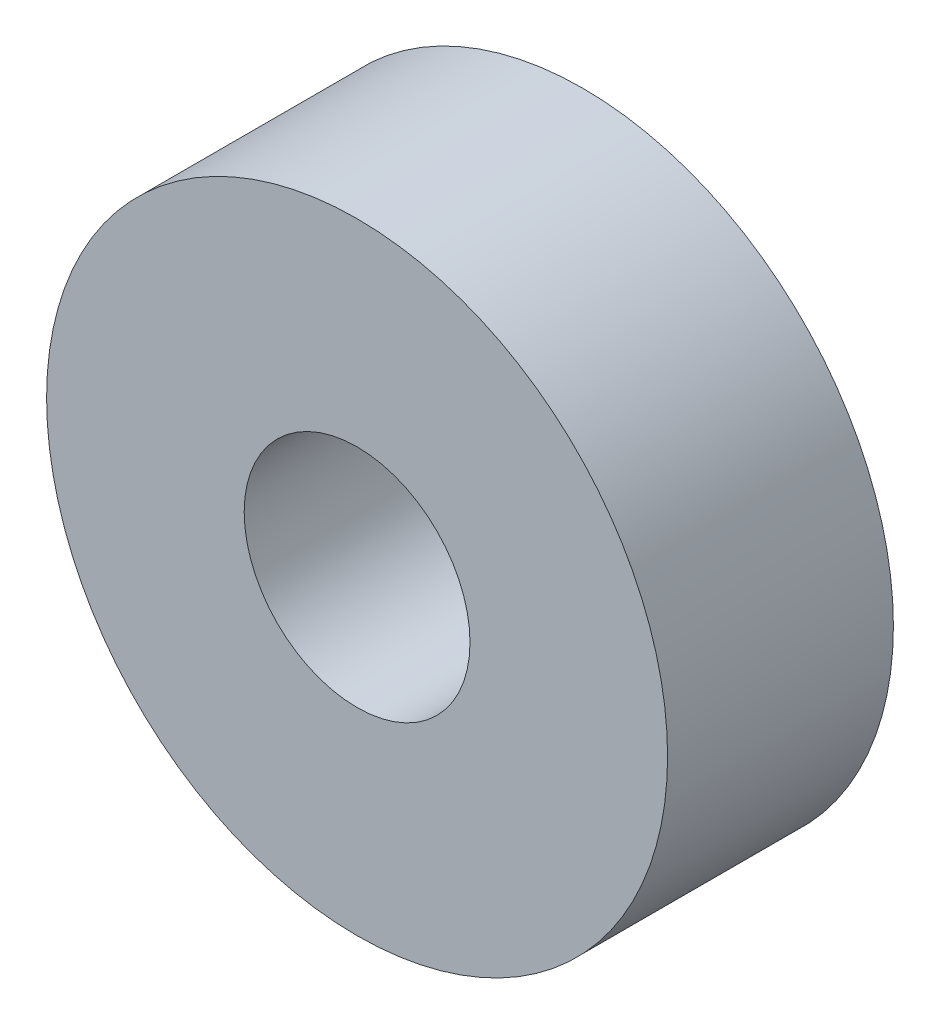
ISO-10303-21;
HEADER;
FILE_DESCRIPTION(('STEP AP214'),'2;1');
FILE_NAME('part.step','',(''),(''),'','','');
FILE_SCHEMA(('AUTOMOTIVE_DESIGN { 1 0 10303 214 1 1 1 1 }'));
ENDSEC;
DATA;
#1=APPLICATION_CONTEXT('core data for automotive mechanical design processes');
#2=APPLICATION_PROTOCOL_DEFINITION('international standard','automotive_design',2000,#1);
#3=PRODUCT_CONTEXT('',#1,'mechanical');
#4=PRODUCT('Part','Part','',(#3));
#5=PRODUCT_RELATED_PRODUCT_CATEGORY('part','',(#4));
#6=PRODUCT_DEFINITION_FORMATION('','',#4);
#7=PRODUCT_DEFINITION_CONTEXT('part definition',#1,'design');
#8=PRODUCT_DEFINITION('design','',#6,#7);
#9=PRODUCT_DEFINITION_SHAPE('','',#8);
#10=(LENGTH_UNIT() NAMED_UNIT(*) SI_UNIT(.MILLI.,.METRE.));
#11=(NAMED_UNIT(*) PLANE_ANGLE_UNIT() SI_UNIT($,.RADIAN.));
#12=(NAMED_UNIT(*) SI_UNIT($,.STERADIAN.) SOLID_ANGLE_UNIT());
#13=UNCERTAINTY_MEASURE_WITH_UNIT(LENGTH_MEASURE(1.E-05),#10,'distance_accuracy_value','');
#14=(GEOMETRIC_REPRESENTATION_CONTEXT(3) GLOBAL_UNCERTAINTY_ASSIGNED_CONTEXT((#13)) GLOBAL_UNIT_ASSIGNED_CONTEXT((#10,
#11,#12)) REPRESENTATION_CONTEXT('',''));
#15=CARTESIAN_POINT('',(0.,0.,0.));
#16=DIRECTION('',(0.,0.,1.));
#17=DIRECTION('',(1.,0.,0.));
#18=AXIS2_PLACEMENT_3D('',#15,#16,#17);
#19=CARTESIAN_POINT('',(0.,0.,8.));
#20=DIRECTION('',(0.,0.,-1.));
#21=DIRECTION('',(-1.,0.,0.));
#22=AXIS2_PLACEMENT_3D('',#19,#20,#21);
#23=CYLINDRICAL_SURFACE('',#22,11.);
#24=CARTESIAN_POINT('',(0.,0.,8.));
#25=DIRECTION('',(0.,0.,-1.));
#26=DIRECTION('',(-1.,0.,0.));
#27=AXIS2_PLACEMENT_3D('',#24,#25,#26);
#28=CIRCLE('',#27,11.);
#29=CARTESIAN_POINT('',(-11.,0.,8.));
#30=VERTEX_POINT('',#29);
#31=EDGE_CURVE('E10',#30,#30,#28,.T.);
#32=ORIENTED_EDGE('',*,*,#31,.T.);
#33=EDGE_LOOP('',(#32));
#34=FACE_BOUND('',#33,.T.);
#35=CARTESIAN_POINT('',(0.,0.,0.));
#36=DIRECTION('',(0.,0.,-1.));
#37=DIRECTION('',(-1.,0.,0.));
#38=AXIS2_PLACEMENT_3D('',#35,#36,#37);
#39=CIRCLE('',#38,11.);
#40=CARTESIAN_POINT('',(-11.,0.,0.));
#41=VERTEX_POINT('',#40);
#42=EDGE_CURVE('E44',#41,#41,#39,.T.);
#43=ORIENTED_EDGE('',*,*,#42,.F.);
#44=EDGE_LOOP('',(#43));
#45=FACE_BOUND('',#44,.T.);
#46=ADVANCED_FACE('F30',(#34,#45),#23,.T.);
#47=CARTESIAN_POINT('',(11.,0.,8.));
#48=DIRECTION('',(0.,0.,1.));
#49=DIRECTION('',(1.,0.,0.));
#50=AXIS2_PLACEMENT_3D('',#47,#48,#49);
#51=PLANE('',#50);
#52=CARTESIAN_POINT('',(0.,0.,8.));
#53=DIRECTION('',(0.,0.,-1.));
#54=DIRECTION('',(-1.,0.,0.));
#55=AXIS2_PLACEMENT_3D('',#52,#53,#54);
#56=CIRCLE('',#55,4.);
#57=CARTESIAN_POINT('',(-4.,0.,8.));
#58=VERTEX_POINT('',#57);
#59=EDGE_CURVE('E36',#58,#58,#56,.T.);
#60=ORIENTED_EDGE('',*,*,#59,.T.);
#61=EDGE_LOOP('',(#60));
#62=FACE_BOUND('',#61,.T.);
#63=ORIENTED_EDGE('',*,*,#31,.F.);
#64=EDGE_LOOP('',(#63));
#65=FACE_BOUND('',#64,.T.);
#66=ADVANCED_FACE('F54',(#62,#65),#51,.T.);
#67=CARTESIAN_POINT('',(0.,0.,8.));
#68=DIRECTION('',(0.,0.,-1.));
#69=DIRECTION('',(-1.,0.,0.));
#70=AXIS2_PLACEMENT_3D('',#67,#68,#69);
#71=CYLINDRICAL_SURFACE('',#70,4.);
#72=CARTESIAN_POINT('',(0.,0.,0.));
#73=DIRECTION('',(0.,0.,-1.));
#74=DIRECTION('',(-1.,0.,0.));
#75=AXIS2_PLACEMENT_3D('',#72,#73,#74);
#76=CIRCLE('',#75,4.);
#77=CARTESIAN_POINT('',(-4.,0.,0.));
#78=VERTEX_POINT('',#77);
#79=EDGE_CURVE('E40',#78,#78,#76,.T.);
#80=ORIENTED_EDGE('',*,*,#79,.T.);
#81=EDGE_LOOP('',(#80));
#82=FACE_BOUND('',#81,.T.);
#83=ORIENTED_EDGE('',*,*,#59,.F.);
#84=EDGE_LOOP('',(#83));
#85=FACE_BOUND('',#84,.T.);
#86=ADVANCED_FACE('F58',(#82,#85),#71,.F.);
#87=CARTESIAN_POINT('',(4.,0.,0.));
#88=DIRECTION('',(0.,0.,-1.));
#89=DIRECTION('',(-1.,0.,0.));
#90=AXIS2_PLACEMENT_3D('',#87,#88,#89);
#91=PLANE('',#90);
#92=ORIENTED_EDGE('',*,*,#42,.T.);
#93=EDGE_LOOP('',(#92));
#94=FACE_BOUND('',#93,.T.);
#95=ORIENTED_EDGE('',*,*,#79,.F.);
#96=EDGE_LOOP('',(#95));
#97=FACE_BOUND('',#96,.T.);
#98=ADVANCED_FACE('F50',(#94,#97),#91,.T.);
#99=CLOSED_SHELL('',(#46,#66,#86,#98));
#100=MANIFOLD_SOLID_BREP('B2',#99);
#101=ADVANCED_BREP_SHAPE_REPRESENTATION('',(#18,#100),#14);
#102=SHAPE_DEFINITION_REPRESENTATION(#9,#101);
ENDSEC;
END-ISO-10303-21;
